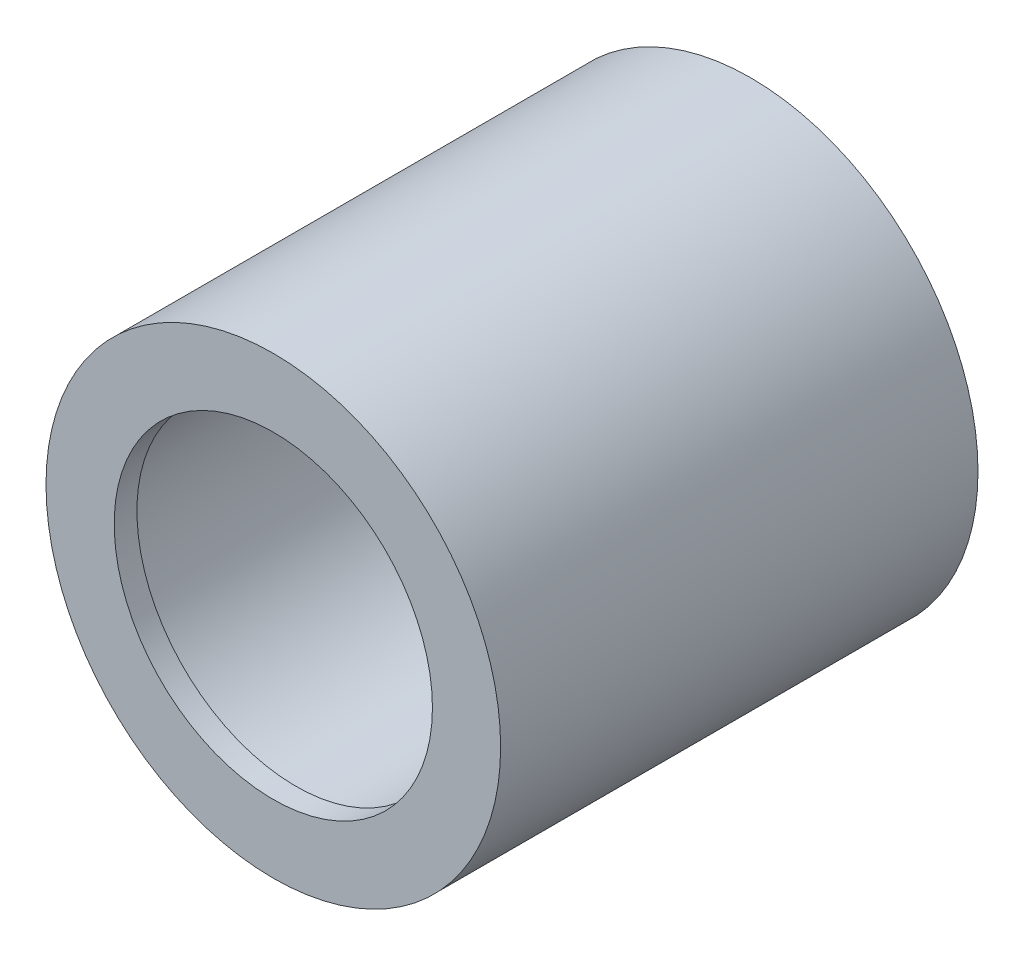
ISO-10303-21;
HEADER;
FILE_DESCRIPTION(('STEP AP214'),'2;1');
FILE_NAME('part.step','',(''),(''),'','','');
FILE_SCHEMA(('AUTOMOTIVE_DESIGN { 1 0 10303 214 1 1 1 1 }'));
ENDSEC;
DATA;
#1=APPLICATION_CONTEXT('core data for automotive mechanical design processes');
#2=APPLICATION_PROTOCOL_DEFINITION('international standard','automotive_design',2000,#1);
#3=PRODUCT_CONTEXT('',#1,'mechanical');
#4=PRODUCT('Part','Part','',(#3));
#5=PRODUCT_RELATED_PRODUCT_CATEGORY('part','',(#4));
#6=PRODUCT_DEFINITION_FORMATION('','',#4);
#7=PRODUCT_DEFINITION_CONTEXT('part definition',#1,'design');
#8=PRODUCT_DEFINITION('design','',#6,#7);
#9=PRODUCT_DEFINITION_SHAPE('','',#8);
#10=(LENGTH_UNIT() NAMED_UNIT(*) SI_UNIT(.MILLI.,.METRE.));
#11=(NAMED_UNIT(*) PLANE_ANGLE_UNIT() SI_UNIT($,.RADIAN.));
#12=(NAMED_UNIT(*) SI_UNIT($,.STERADIAN.) SOLID_ANGLE_UNIT());
#13=UNCERTAINTY_MEASURE_WITH_UNIT(LENGTH_MEASURE(1.E-05),#10,'distance_accuracy_value','');
#14=(GEOMETRIC_REPRESENTATION_CONTEXT(3) GLOBAL_UNCERTAINTY_ASSIGNED_CONTEXT((#13)) GLOBAL_UNIT_ASSIGNED_CONTEXT((#10,
#11,#12)) REPRESENTATION_CONTEXT('',''));
#15=CARTESIAN_POINT('',(0.,0.,0.));
#16=DIRECTION('',(0.,0.,1.));
#17=DIRECTION('',(1.,0.,0.));
#18=AXIS2_PLACEMENT_3D('',#15,#16,#17);
#19=CARTESIAN_POINT('',(0.,0.,-10.3237590053236));
#20=DIRECTION('',(0.,0.,1.));
#21=DIRECTION('',(1.,0.,0.));
#22=AXIS2_PLACEMENT_3D('',#19,#20,#21);
#23=CYLINDRICAL_SURFACE('',#22,3.65);
#24=CARTESIAN_POINT('',(0.,0.,10.));
#25=DIRECTION('',(0.,0.,1.));
#26=DIRECTION('',(1.,0.,0.));
#27=AXIS2_PLACEMENT_3D('',#24,#25,#26);
#28=CIRCLE('',#27,3.65);
#29=CARTESIAN_POINT('',(3.65,0.,10.));
#30=VERTEX_POINT('',#29);
#31=EDGE_CURVE('E164',#30,#30,#28,.T.);
#32=ORIENTED_EDGE('',*,*,#31,.T.);
#33=EDGE_LOOP('',(#32));
#34=FACE_BOUND('',#33,.T.);
#35=CARTESIAN_POINT('',(0.,0.,5.));
#36=DIRECTION('',(0.,0.,-1.));
#37=DIRECTION('',(-1.,0.,0.));
#38=AXIS2_PLACEMENT_3D('',#35,#36,#37);
#39=CIRCLE('',#38,3.65);
#40=CARTESIAN_POINT('',(-3.65,0.,5.));
#41=VERTEX_POINT('',#40);
#42=CARTESIAN_POINT('',(-1.825,-3.1609927238132,5.));
#43=VERTEX_POINT('',#42);
#44=EDGE_CURVE('E11',#41,#43,#39,.F.);
#45=ORIENTED_EDGE('',*,*,#44,.F.);
#46=CARTESIAN_POINT('',(-1.825,3.1609927238132,5.));
#47=VERTEX_POINT('',#46);
#48=EDGE_CURVE('E43',#47,#41,#39,.F.);
#49=ORIENTED_EDGE('',*,*,#48,.F.);
#50=CARTESIAN_POINT('',(1.825,3.1609927238132,5.));
#51=VERTEX_POINT('',#50);
#52=EDGE_CURVE('E117',#51,#47,#39,.F.);
#53=ORIENTED_EDGE('',*,*,#52,.F.);
#54=CARTESIAN_POINT('',(3.65,0.,5.));
#55=VERTEX_POINT('',#54);
#56=EDGE_CURVE('E210',#55,#51,#39,.F.);
#57=ORIENTED_EDGE('',*,*,#56,.F.);
#58=CARTESIAN_POINT('',(1.825,-3.1609927238132,5.));
#59=VERTEX_POINT('',#58);
#60=EDGE_CURVE('E212',#59,#55,#39,.F.);
#61=ORIENTED_EDGE('',*,*,#60,.F.);
#62=EDGE_CURVE('E49',#43,#59,#39,.F.);
#63=ORIENTED_EDGE('',*,*,#62,.F.);
#64=EDGE_LOOP('',(#45,#49,#53,#57,#61,#63));
#65=FACE_BOUND('',#64,.T.);
#66=ADVANCED_FACE('F39',(#34,#65),#23,.F.);
#67=CARTESIAN_POINT('',(0.,0.,10.));
#68=DIRECTION('',(0.,0.,-1.));
#69=DIRECTION('',(-1.,0.,0.));
#70=AXIS2_PLACEMENT_3D('',#67,#68,#69);
#71=CYLINDRICAL_SURFACE('',#70,5.);
#72=CARTESIAN_POINT('',(0.,0.,0.));
#73=DIRECTION('',(0.,0.,1.));
#74=DIRECTION('',(1.,0.,0.));
#75=AXIS2_PLACEMENT_3D('',#72,#73,#74);
#76=CIRCLE('',#75,5.);
#77=CARTESIAN_POINT('',(5.,0.,0.));
#78=VERTEX_POINT('',#77);
#79=EDGE_CURVE('E184',#78,#78,#76,.T.);
#80=ORIENTED_EDGE('',*,*,#79,.T.);
#81=EDGE_LOOP('',(#80));
#82=FACE_BOUND('',#81,.T.);
#83=CARTESIAN_POINT('',(0.,0.,10.5));
#84=DIRECTION('',(0.,0.,1.));
#85=DIRECTION('',(1.,0.,0.));
#86=AXIS2_PLACEMENT_3D('',#83,#84,#85);
#87=CIRCLE('',#86,5.);
#88=CARTESIAN_POINT('',(5.,0.,10.5));
#89=VERTEX_POINT('',#88);
#90=EDGE_CURVE('E202',#89,#89,#87,.T.);
#91=ORIENTED_EDGE('',*,*,#90,.F.);
#92=EDGE_LOOP('',(#91));
#93=FACE_BOUND('',#92,.T.);
#94=ADVANCED_FACE('F41',(#82,#93),#71,.T.);
#95=CARTESIAN_POINT('',(0.,0.,0.));
#96=DIRECTION('',(0.,0.,1.));
#97=DIRECTION('',(1.,0.,0.));
#98=AXIS2_PLACEMENT_3D('',#95,#96,#97);
#99=PLANE('',#98);
#100=DIRECTION('',(0.866025403784439,-0.5,0.));
#101=VECTOR('',#100,1.);
#102=CARTESIAN_POINT('',(0.,4.21465696508427,0.));
#103=LINE('',#102,#101);
#104=CARTESIAN_POINT('',(0.,4.21465696508427,0.));
#105=VERTEX_POINT('',#104);
#106=CARTESIAN_POINT('',(3.65,2.10732848254214,0.));
#107=VERTEX_POINT('',#106);
#108=EDGE_CURVE('E56',#105,#107,#103,.T.);
#109=ORIENTED_EDGE('',*,*,#108,.F.);
#110=DIRECTION('',(0.866025403784439,0.5,0.));
#111=VECTOR('',#110,1.);
#112=CARTESIAN_POINT('',(-3.65,2.10732848254214,0.));
#113=LINE('',#112,#111);
#114=CARTESIAN_POINT('',(-3.65,2.10732848254214,0.));
#115=VERTEX_POINT('',#114);
#116=EDGE_CURVE('E127',#115,#105,#113,.T.);
#117=ORIENTED_EDGE('',*,*,#116,.F.);
#118=DIRECTION('',(0.,1.,0.));
#119=VECTOR('',#118,1.);
#120=CARTESIAN_POINT('',(-3.65,-2.10732848254213,0.));
#121=LINE('',#120,#119);
#122=CARTESIAN_POINT('',(-3.65,-2.10732848254213,0.));
#123=VERTEX_POINT('',#122);
#124=EDGE_CURVE('E121',#123,#115,#121,.T.);
#125=ORIENTED_EDGE('',*,*,#124,.F.);
#126=DIRECTION('',(-0.866025403784439,0.5,0.));
#127=VECTOR('',#126,1.);
#128=CARTESIAN_POINT('',(0.,-4.21465696508427,0.));
#129=LINE('',#128,#127);
#130=CARTESIAN_POINT('',(0.,-4.21465696508427,0.));
#131=VERTEX_POINT('',#130);
#132=EDGE_CURVE('E175',#131,#123,#129,.T.);
#133=ORIENTED_EDGE('',*,*,#132,.F.);
#134=DIRECTION('',(-0.866025403784439,-0.5,0.));
#135=VECTOR('',#134,1.);
#136=CARTESIAN_POINT('',(3.65,-2.10732848254213,0.));
#137=LINE('',#136,#135);
#138=CARTESIAN_POINT('',(3.65,-2.10732848254213,0.));
#139=VERTEX_POINT('',#138);
#140=EDGE_CURVE('E171',#139,#131,#137,.T.);
#141=ORIENTED_EDGE('',*,*,#140,.F.);
#142=DIRECTION('',(0.,-1.,0.));
#143=VECTOR('',#142,1.);
#144=CARTESIAN_POINT('',(3.65,2.10732848254214,0.));
#145=LINE('',#144,#143);
#146=EDGE_CURVE('E167',#107,#139,#145,.T.);
#147=ORIENTED_EDGE('',*,*,#146,.F.);
#148=EDGE_LOOP('',(#109,#117,#125,#133,#141,#147));
#149=FACE_BOUND('',#148,.T.);
#150=ORIENTED_EDGE('',*,*,#79,.F.);
#151=EDGE_LOOP('',(#150));
#152=FACE_BOUND('',#151,.T.);
#153=ADVANCED_FACE('F281',(#149,#152),#99,.F.);
#154=CARTESIAN_POINT('',(-3.65,2.10732848254214,5.));
#155=DIRECTION('',(-0.5,0.866025403784439,0.));
#156=DIRECTION('',(-0.866025403784439,-0.5,0.));
#157=AXIS2_PLACEMENT_3D('',#154,#155,#156);
#158=PLANE('',#157);
#159=DIRECTION('',(0.866025403784439,0.5,0.));
#160=VECTOR('',#159,1.);
#161=CARTESIAN_POINT('',(-3.65,2.10732848254214,5.));
#162=LINE('',#161,#160);
#163=CARTESIAN_POINT('',(-3.65,2.10732848254214,5.));
#164=VERTEX_POINT('',#163);
#165=EDGE_CURVE('E64',#164,#47,#162,.T.);
#166=ORIENTED_EDGE('',*,*,#165,.F.);
#167=DIRECTION('',(0.,0.,-1.));
#168=VECTOR('',#167,1.);
#169=CARTESIAN_POINT('',(-3.65,2.10732848254214,5.));
#170=LINE('',#169,#168);
#171=EDGE_CURVE('E181',#164,#115,#170,.T.);
#172=ORIENTED_EDGE('',*,*,#171,.T.);
#173=ORIENTED_EDGE('',*,*,#116,.T.);
#174=DIRECTION('',(0.,0.,-1.));
#175=VECTOR('',#174,1.);
#176=CARTESIAN_POINT('',(0.,4.21465696508427,5.));
#177=LINE('',#176,#175);
#178=CARTESIAN_POINT('',(0.,4.21465696508427,5.));
#179=VERTEX_POINT('',#178);
#180=EDGE_CURVE('E124',#179,#105,#177,.T.);
#181=ORIENTED_EDGE('',*,*,#180,.F.);
#182=EDGE_CURVE('E111',#47,#179,#162,.T.);
#183=ORIENTED_EDGE('',*,*,#182,.F.);
#184=EDGE_LOOP('',(#166,#172,#173,#181,#183));
#185=FACE_BOUND('',#184,.T.);
#186=ADVANCED_FACE('F125',(#185),#158,.F.);
#187=CARTESIAN_POINT('',(-3.65,-2.10732848254213,5.));
#188=DIRECTION('',(-1.,0.,0.));
#189=DIRECTION('',(0.,-1.,0.));
#190=AXIS2_PLACEMENT_3D('',#187,#188,#189);
#191=PLANE('',#190);
#192=DIRECTION('',(0.,1.,0.));
#193=VECTOR('',#192,1.);
#194=CARTESIAN_POINT('',(-3.65,-2.10732848254213,5.));
#195=LINE('',#194,#193);
#196=CARTESIAN_POINT('',(-3.65,-2.10732848254213,5.));
#197=VERTEX_POINT('',#196);
#198=EDGE_CURVE('E131',#197,#41,#195,.T.);
#199=ORIENTED_EDGE('',*,*,#198,.F.);
#200=DIRECTION('',(0.,0.,-1.));
#201=VECTOR('',#200,1.);
#202=CARTESIAN_POINT('',(-3.65,-2.10732848254213,5.));
#203=LINE('',#202,#201);
#204=EDGE_CURVE('E185',#197,#123,#203,.T.);
#205=ORIENTED_EDGE('',*,*,#204,.T.);
#206=ORIENTED_EDGE('',*,*,#124,.T.);
#207=ORIENTED_EDGE('',*,*,#171,.F.);
#208=EDGE_CURVE('E158',#41,#164,#195,.T.);
#209=ORIENTED_EDGE('',*,*,#208,.F.);
#210=EDGE_LOOP('',(#199,#205,#206,#207,#209));
#211=FACE_BOUND('',#210,.T.);
#212=ADVANCED_FACE('F246',(#211),#191,.F.);
#213=CARTESIAN_POINT('',(0.,-4.21465696508427,5.));
#214=DIRECTION('',(-0.5,-0.866025403784439,0.));
#215=DIRECTION('',(0.866025403784439,-0.5,0.));
#216=AXIS2_PLACEMENT_3D('',#213,#214,#215);
#217=PLANE('',#216);
#218=DIRECTION('',(-0.866025403784439,0.5,0.));
#219=VECTOR('',#218,1.);
#220=CARTESIAN_POINT('',(0.,-4.21465696508427,5.));
#221=LINE('',#220,#219);
#222=CARTESIAN_POINT('',(0.,-4.21465696508427,5.));
#223=VERTEX_POINT('',#222);
#224=EDGE_CURVE('E154',#223,#43,#221,.T.);
#225=ORIENTED_EDGE('',*,*,#224,.F.);
#226=DIRECTION('',(0.,0.,-1.));
#227=VECTOR('',#226,1.);
#228=CARTESIAN_POINT('',(0.,-4.21465696508427,5.));
#229=LINE('',#228,#227);
#230=EDGE_CURVE('E189',#223,#131,#229,.T.);
#231=ORIENTED_EDGE('',*,*,#230,.T.);
#232=ORIENTED_EDGE('',*,*,#132,.T.);
#233=ORIENTED_EDGE('',*,*,#204,.F.);
#234=EDGE_CURVE('E153',#43,#197,#221,.T.);
#235=ORIENTED_EDGE('',*,*,#234,.F.);
#236=EDGE_LOOP('',(#225,#231,#232,#233,#235));
#237=FACE_BOUND('',#236,.T.);
#238=ADVANCED_FACE('F240',(#237),#217,.F.);
#239=CARTESIAN_POINT('',(3.65,-2.10732848254213,5.));
#240=DIRECTION('',(0.5,-0.866025403784439,0.));
#241=DIRECTION('',(0.866025403784439,0.5,0.));
#242=AXIS2_PLACEMENT_3D('',#239,#240,#241);
#243=PLANE('',#242);
#244=DIRECTION('',(-0.866025403784439,-0.5,0.));
#245=VECTOR('',#244,1.);
#246=CARTESIAN_POINT('',(3.65,-2.10732848254213,5.));
#247=LINE('',#246,#245);
#248=CARTESIAN_POINT('',(3.65,-2.10732848254213,5.));
#249=VERTEX_POINT('',#248);
#250=EDGE_CURVE('E149',#249,#59,#247,.T.);
#251=ORIENTED_EDGE('',*,*,#250,.F.);
#252=DIRECTION('',(0.,0.,-1.));
#253=VECTOR('',#252,1.);
#254=CARTESIAN_POINT('',(3.65,-2.10732848254213,5.));
#255=LINE('',#254,#253);
#256=EDGE_CURVE('E193',#249,#139,#255,.T.);
#257=ORIENTED_EDGE('',*,*,#256,.T.);
#258=ORIENTED_EDGE('',*,*,#140,.T.);
#259=ORIENTED_EDGE('',*,*,#230,.F.);
#260=EDGE_CURVE('E148',#59,#223,#247,.T.);
#261=ORIENTED_EDGE('',*,*,#260,.F.);
#262=EDGE_LOOP('',(#251,#257,#258,#259,#261));
#263=FACE_BOUND('',#262,.T.);
#264=ADVANCED_FACE('F230',(#263),#243,.F.);
#265=CARTESIAN_POINT('',(3.65,2.10732848254214,5.));
#266=DIRECTION('',(1.,0.,0.));
#267=DIRECTION('',(0.,1.,0.));
#268=AXIS2_PLACEMENT_3D('',#265,#266,#267);
#269=PLANE('',#268);
#270=DIRECTION('',(0.,-1.,0.));
#271=VECTOR('',#270,1.);
#272=CARTESIAN_POINT('',(3.65,2.10732848254214,5.));
#273=LINE('',#272,#271);
#274=CARTESIAN_POINT('',(3.65,2.10732848254214,5.));
#275=VERTEX_POINT('',#274);
#276=EDGE_CURVE('E142',#275,#55,#273,.T.);
#277=ORIENTED_EDGE('',*,*,#276,.F.);
#278=DIRECTION('',(0.,0.,-1.));
#279=VECTOR('',#278,1.);
#280=CARTESIAN_POINT('',(3.65,2.10732848254214,5.));
#281=LINE('',#280,#279);
#282=EDGE_CURVE('E130',#275,#107,#281,.T.);
#283=ORIENTED_EDGE('',*,*,#282,.T.);
#284=ORIENTED_EDGE('',*,*,#146,.T.);
#285=ORIENTED_EDGE('',*,*,#256,.F.);
#286=EDGE_CURVE('E138',#55,#249,#273,.T.);
#287=ORIENTED_EDGE('',*,*,#286,.F.);
#288=EDGE_LOOP('',(#277,#283,#284,#285,#287));
#289=FACE_BOUND('',#288,.T.);
#290=ADVANCED_FACE('F301',(#289),#269,.F.);
#291=CARTESIAN_POINT('',(0.,4.21465696508427,5.));
#292=DIRECTION('',(0.5,0.866025403784439,0.));
#293=DIRECTION('',(-0.866025403784439,0.5,0.));
#294=AXIS2_PLACEMENT_3D('',#291,#292,#293);
#295=PLANE('',#294);
#296=DIRECTION('',(0.866025403784439,-0.5,0.));
#297=VECTOR('',#296,1.);
#298=CARTESIAN_POINT('',(0.,4.21465696508427,5.));
#299=LINE('',#298,#297);
#300=EDGE_CURVE('E115',#179,#51,#299,.T.);
#301=ORIENTED_EDGE('',*,*,#300,.F.);
#302=ORIENTED_EDGE('',*,*,#180,.T.);
#303=ORIENTED_EDGE('',*,*,#108,.T.);
#304=ORIENTED_EDGE('',*,*,#282,.F.);
#305=EDGE_CURVE('E136',#51,#275,#299,.T.);
#306=ORIENTED_EDGE('',*,*,#305,.F.);
#307=EDGE_LOOP('',(#301,#302,#303,#304,#306));
#308=FACE_BOUND('',#307,.T.);
#309=ADVANCED_FACE('F134',(#308),#295,.F.);
#310=CARTESIAN_POINT('',(0.,0.,5.));
#311=DIRECTION('',(0.,0.,-1.));
#312=DIRECTION('',(-1.,0.,0.));
#313=AXIS2_PLACEMENT_3D('',#310,#311,#312);
#314=PLANE('',#313);
#315=ORIENTED_EDGE('',*,*,#44,.T.);
#316=ORIENTED_EDGE('',*,*,#234,.T.);
#317=ORIENTED_EDGE('',*,*,#198,.T.);
#318=EDGE_LOOP('',(#315,#316,#317));
#319=FACE_BOUND('',#318,.T.);
#320=ADVANCED_FACE('F236',(#319),#314,.T.);
#321=ORIENTED_EDGE('',*,*,#62,.T.);
#322=ORIENTED_EDGE('',*,*,#260,.T.);
#323=ORIENTED_EDGE('',*,*,#224,.T.);
#324=EDGE_LOOP('',(#321,#322,#323));
#325=FACE_BOUND('',#324,.T.);
#326=ADVANCED_FACE('F223',(#325),#314,.T.);
#327=ORIENTED_EDGE('',*,*,#60,.T.);
#328=ORIENTED_EDGE('',*,*,#286,.T.);
#329=ORIENTED_EDGE('',*,*,#250,.T.);
#330=EDGE_LOOP('',(#327,#328,#329));
#331=FACE_BOUND('',#330,.T.);
#332=ADVANCED_FACE('F232',(#331),#314,.T.);
#333=ORIENTED_EDGE('',*,*,#56,.T.);
#334=ORIENTED_EDGE('',*,*,#305,.T.);
#335=ORIENTED_EDGE('',*,*,#276,.T.);
#336=EDGE_LOOP('',(#333,#334,#335));
#337=FACE_BOUND('',#336,.T.);
#338=ADVANCED_FACE('F316',(#337),#314,.T.);
#339=ORIENTED_EDGE('',*,*,#52,.T.);
#340=ORIENTED_EDGE('',*,*,#182,.T.);
#341=ORIENTED_EDGE('',*,*,#300,.T.);
#342=EDGE_LOOP('',(#339,#340,#341));
#343=FACE_BOUND('',#342,.T.);
#344=ADVANCED_FACE('F113',(#343),#314,.T.);
#345=ORIENTED_EDGE('',*,*,#48,.T.);
#346=ORIENTED_EDGE('',*,*,#208,.T.);
#347=ORIENTED_EDGE('',*,*,#165,.T.);
#348=EDGE_LOOP('',(#345,#346,#347));
#349=FACE_BOUND('',#348,.T.);
#350=ADVANCED_FACE('F244',(#349),#314,.T.);
#351=CARTESIAN_POINT('',(0.,0.,10.));
#352=DIRECTION('',(0.,0.,1.));
#353=DIRECTION('',(1.,0.,0.));
#354=AXIS2_PLACEMENT_3D('',#351,#352,#353);
#355=PLANE('',#354);
#356=CARTESIAN_POINT('',(0.,0.,10.));
#357=DIRECTION('',(0.,0.,1.));
#358=DIRECTION('',(1.,0.,0.));
#359=AXIS2_PLACEMENT_3D('',#356,#357,#358);
#360=CIRCLE('',#359,3.5);
#361=CARTESIAN_POINT('',(3.5,0.,10.));
#362=VERTEX_POINT('',#361);
#363=EDGE_CURVE('E255',#362,#362,#360,.T.);
#364=ORIENTED_EDGE('',*,*,#363,.T.);
#365=EDGE_LOOP('',(#364));
#366=FACE_BOUND('',#365,.T.);
#367=ORIENTED_EDGE('',*,*,#31,.F.);
#368=EDGE_LOOP('',(#367));
#369=FACE_BOUND('',#368,.T.);
#370=ADVANCED_FACE('F261',(#366,#369),#355,.F.);
#371=CARTESIAN_POINT('',(0.,0.,10.5));
#372=DIRECTION('',(0.,0.,1.));
#373=DIRECTION('',(1.,0.,0.));
#374=AXIS2_PLACEMENT_3D('',#371,#372,#373);
#375=PLANE('',#374);
#376=ORIENTED_EDGE('',*,*,#90,.T.);
#377=EDGE_LOOP('',(#376));
#378=FACE_BOUND('',#377,.T.);
#379=CARTESIAN_POINT('',(0.,0.,10.5));
#380=DIRECTION('',(0.,0.,1.));
#381=DIRECTION('',(1.,0.,0.));
#382=AXIS2_PLACEMENT_3D('',#379,#380,#381);
#383=CIRCLE('',#382,3.5);
#384=CARTESIAN_POINT('',(3.5,0.,10.5));
#385=VERTEX_POINT('',#384);
#386=EDGE_CURVE('E252',#385,#385,#383,.T.);
#387=ORIENTED_EDGE('',*,*,#386,.F.);
#388=EDGE_LOOP('',(#387));
#389=FACE_BOUND('',#388,.T.);
#390=ADVANCED_FACE('F266',(#378,#389),#375,.T.);
#391=CARTESIAN_POINT('',(0.,0.,10.5));
#392=DIRECTION('',(0.,0.,-1.));
#393=DIRECTION('',(-1.,0.,0.));
#394=AXIS2_PLACEMENT_3D('',#391,#392,#393);
#395=CYLINDRICAL_SURFACE('',#394,3.5);
#396=ORIENTED_EDGE('',*,*,#386,.T.);
#397=EDGE_LOOP('',(#396));
#398=FACE_BOUND('',#397,.T.);
#399=ORIENTED_EDGE('',*,*,#363,.F.);
#400=EDGE_LOOP('',(#399));
#401=FACE_BOUND('',#400,.T.);
#402=ADVANCED_FACE('F264',(#398,#401),#395,.F.);
#403=CLOSED_SHELL('',(#66,#94,#153,#186,#212,#238,#264,#290,#309,#320,#326,#332,#338,#344,#350,
#370,#390,#402));
#404=MANIFOLD_SOLID_BREP('B2',#403);
#405=ADVANCED_BREP_SHAPE_REPRESENTATION('',(#18,#404),#14);
#406=SHAPE_DEFINITION_REPRESENTATION(#9,#405);
ENDSEC;
END-ISO-10303-21;
